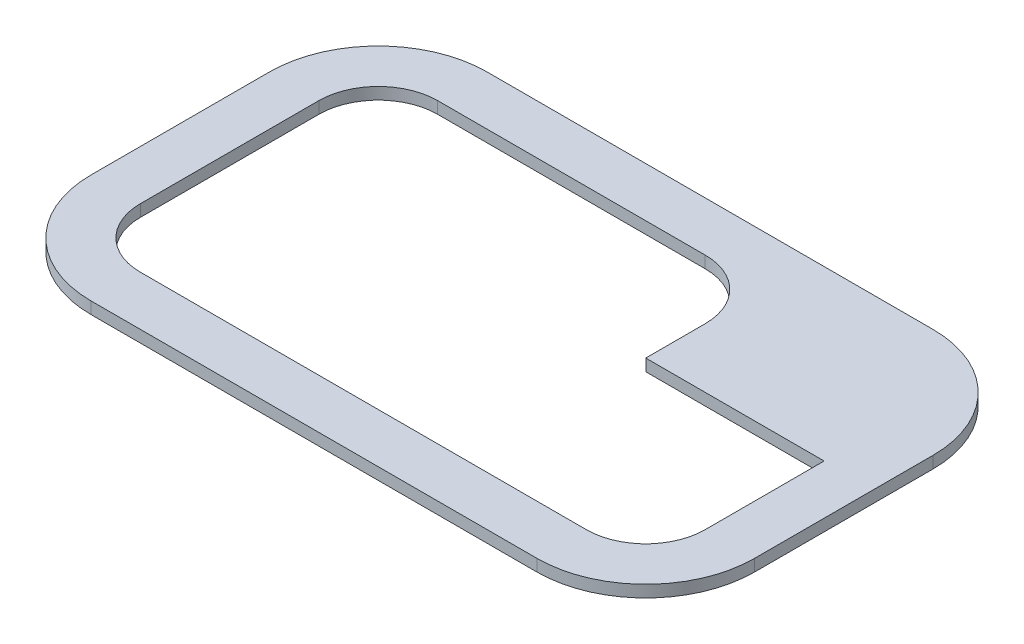
ISO-10303-21;
HEADER;
FILE_DESCRIPTION(('STEP AP214'),'2;1');
FILE_NAME('part.step','',(''),(''),'','','');
FILE_SCHEMA(('AUTOMOTIVE_DESIGN { 1 0 10303 214 1 1 1 1 }'));
ENDSEC;
DATA;
#1=APPLICATION_CONTEXT('core data for automotive mechanical design processes');
#2=APPLICATION_PROTOCOL_DEFINITION('international standard','automotive_design',2000,#1);
#3=PRODUCT_CONTEXT('',#1,'mechanical');
#4=PRODUCT('Part','Part','',(#3));
#5=PRODUCT_RELATED_PRODUCT_CATEGORY('part','',(#4));
#6=PRODUCT_DEFINITION_FORMATION('','',#4);
#7=PRODUCT_DEFINITION_CONTEXT('part definition',#1,'design');
#8=PRODUCT_DEFINITION('design','',#6,#7);
#9=PRODUCT_DEFINITION_SHAPE('','',#8);
#10=(LENGTH_UNIT() NAMED_UNIT(*) SI_UNIT(.MILLI.,.METRE.));
#11=(NAMED_UNIT(*) PLANE_ANGLE_UNIT() SI_UNIT($,.RADIAN.));
#12=(NAMED_UNIT(*) SI_UNIT($,.STERADIAN.) SOLID_ANGLE_UNIT());
#13=UNCERTAINTY_MEASURE_WITH_UNIT(LENGTH_MEASURE(1.E-05),#10,'distance_accuracy_value','');
#14=(GEOMETRIC_REPRESENTATION_CONTEXT(3) GLOBAL_UNCERTAINTY_ASSIGNED_CONTEXT((#13)) GLOBAL_UNIT_ASSIGNED_CONTEXT((#10,
#11,#12)) REPRESENTATION_CONTEXT('',''));
#15=CARTESIAN_POINT('',(0.,0.,0.));
#16=DIRECTION('',(0.,0.,1.));
#17=DIRECTION('',(1.,0.,0.));
#18=AXIS2_PLACEMENT_3D('',#15,#16,#17);
#19=CARTESIAN_POINT('',(225.,6.,-90.));
#20=DIRECTION('',(0.,-1.,0.));
#21=DIRECTION('',(0.,0.,-1.));
#22=AXIS2_PLACEMENT_3D('',#19,#20,#21);
#23=PLANE('',#22);
#24=CARTESIAN_POINT('',(225.,6.,-90.));
#25=DIRECTION('',(0.,1.,0.));
#26=DIRECTION('',(0.,0.,-1.));
#27=AXIS2_PLACEMENT_3D('',#24,#25,#26);
#28=CIRCLE('',#27,55.);
#29=CARTESIAN_POINT('',(280.,6.,-90.));
#30=VERTEX_POINT('',#29);
#31=CARTESIAN_POINT('',(225.,6.,-145.));
#32=VERTEX_POINT('',#31);
#33=EDGE_CURVE('E239',#30,#32,#28,.T.);
#34=ORIENTED_EDGE('',*,*,#33,.T.);
#35=DIRECTION('',(-1.,0.,0.));
#36=VECTOR('',#35,1.);
#37=CARTESIAN_POINT('',(0.,6.,-145.));
#38=LINE('',#37,#36);
#39=CARTESIAN_POINT('',(0.,6.,-145.));
#40=VERTEX_POINT('',#39);
#41=EDGE_CURVE('E242',#32,#40,#38,.T.);
#42=ORIENTED_EDGE('',*,*,#41,.T.);
#43=CARTESIAN_POINT('',(0.,6.,-90.));
#44=DIRECTION('',(0.,1.,0.));
#45=DIRECTION('',(0.,0.,-1.));
#46=AXIS2_PLACEMENT_3D('',#43,#44,#45);
#47=CIRCLE('',#46,55.);
#48=CARTESIAN_POINT('',(-55.,6.,-90.));
#49=VERTEX_POINT('',#48);
#50=EDGE_CURVE('E245',#40,#49,#47,.T.);
#51=ORIENTED_EDGE('',*,*,#50,.T.);
#52=DIRECTION('',(0.,0.,1.));
#53=VECTOR('',#52,1.);
#54=CARTESIAN_POINT('',(-55.,6.,0.));
#55=LINE('',#54,#53);
#56=CARTESIAN_POINT('',(-55.,6.,0.));
#57=VERTEX_POINT('',#56);
#58=EDGE_CURVE('E247',#49,#57,#55,.T.);
#59=ORIENTED_EDGE('',*,*,#58,.T.);
#60=CARTESIAN_POINT('',(0.,6.,0.));
#61=DIRECTION('',(0.,1.,0.));
#62=DIRECTION('',(0.,0.,-1.));
#63=AXIS2_PLACEMENT_3D('',#60,#61,#62);
#64=CIRCLE('',#63,55.);
#65=CARTESIAN_POINT('',(0.,6.,55.));
#66=VERTEX_POINT('',#65);
#67=EDGE_CURVE('E249',#57,#66,#64,.T.);
#68=ORIENTED_EDGE('',*,*,#67,.T.);
#69=DIRECTION('',(1.,0.,0.));
#70=VECTOR('',#69,1.);
#71=CARTESIAN_POINT('',(0.,6.,55.));
#72=LINE('',#71,#70);
#73=CARTESIAN_POINT('',(225.,6.,55.));
#74=VERTEX_POINT('',#73);
#75=EDGE_CURVE('E251',#66,#74,#72,.T.);
#76=ORIENTED_EDGE('',*,*,#75,.T.);
#77=CARTESIAN_POINT('',(225.,6.,0.));
#78=DIRECTION('',(0.,1.,0.));
#79=DIRECTION('',(0.,0.,1.));
#80=AXIS2_PLACEMENT_3D('',#77,#78,#79);
#81=CIRCLE('',#80,55.);
#82=CARTESIAN_POINT('',(280.,6.,0.));
#83=VERTEX_POINT('',#82);
#84=EDGE_CURVE('E253',#74,#83,#81,.T.);
#85=ORIENTED_EDGE('',*,*,#84,.T.);
#86=DIRECTION('',(0.,0.,-1.));
#87=VECTOR('',#86,1.);
#88=CARTESIAN_POINT('',(280.,6.,0.));
#89=LINE('',#88,#87);
#90=EDGE_CURVE('E255',#83,#30,#89,.T.);
#91=ORIENTED_EDGE('',*,*,#90,.T.);
#92=EDGE_LOOP('',(#34,#42,#51,#59,#68,#76,#85,#91));
#93=FACE_BOUND('',#92,.T.);
#94=CARTESIAN_POINT('',(0.,6.,0.));
#95=DIRECTION('',(0.,1.,0.));
#96=DIRECTION('',(0.,0.,-1.));
#97=AXIS2_PLACEMENT_3D('',#94,#95,#96);
#98=CIRCLE('',#97,30.);
#99=CARTESIAN_POINT('',(-30.,6.,0.));
#100=VERTEX_POINT('',#99);
#101=CARTESIAN_POINT('',(0.,6.,30.));
#102=VERTEX_POINT('',#101);
#103=EDGE_CURVE('E160',#100,#102,#98,.T.);
#104=ORIENTED_EDGE('',*,*,#103,.F.);
#105=DIRECTION('',(0.,0.,1.));
#106=VECTOR('',#105,1.);
#107=CARTESIAN_POINT('',(-30.,6.,0.));
#108=LINE('',#107,#106);
#109=CARTESIAN_POINT('',(-30.,6.,-90.));
#110=VERTEX_POINT('',#109);
#111=EDGE_CURVE('E197',#110,#100,#108,.T.);
#112=ORIENTED_EDGE('',*,*,#111,.F.);
#113=CARTESIAN_POINT('',(0.,6.,-90.));
#114=DIRECTION('',(0.,1.,0.));
#115=DIRECTION('',(0.,0.,-1.));
#116=AXIS2_PLACEMENT_3D('',#113,#114,#115);
#117=CIRCLE('',#116,30.);
#118=CARTESIAN_POINT('',(0.,6.,-120.));
#119=VERTEX_POINT('',#118);
#120=EDGE_CURVE('E195',#119,#110,#117,.T.);
#121=ORIENTED_EDGE('',*,*,#120,.F.);
#122=DIRECTION('',(-1.,0.,0.));
#123=VECTOR('',#122,1.);
#124=CARTESIAN_POINT('',(0.,6.,-120.));
#125=LINE('',#124,#123);
#126=CARTESIAN_POINT('',(135.,6.,-120.));
#127=VERTEX_POINT('',#126);
#128=EDGE_CURVE('E193',#127,#119,#125,.T.);
#129=ORIENTED_EDGE('',*,*,#128,.F.);
#130=CARTESIAN_POINT('',(135.,6.,-90.));
#131=DIRECTION('',(0.,1.,0.));
#132=DIRECTION('',(0.,0.,-1.));
#133=AXIS2_PLACEMENT_3D('',#130,#131,#132);
#134=CIRCLE('',#133,30.);
#135=CARTESIAN_POINT('',(165.,6.,-90.));
#136=VERTEX_POINT('',#135);
#137=EDGE_CURVE('E191',#136,#127,#134,.T.);
#138=ORIENTED_EDGE('',*,*,#137,.F.);
#139=DIRECTION('',(0.,0.,-1.));
#140=VECTOR('',#139,1.);
#141=CARTESIAN_POINT('',(165.,6.,-90.));
#142=LINE('',#141,#140);
#143=CARTESIAN_POINT('',(165.,6.,-60.));
#144=VERTEX_POINT('',#143);
#145=EDGE_CURVE('E189',#144,#136,#142,.T.);
#146=ORIENTED_EDGE('',*,*,#145,.F.);
#147=DIRECTION('',(-1.,0.,0.));
#148=VECTOR('',#147,1.);
#149=CARTESIAN_POINT('',(165.,6.,-60.));
#150=LINE('',#149,#148);
#151=CARTESIAN_POINT('',(255.,6.,-60.));
#152=VERTEX_POINT('',#151);
#153=EDGE_CURVE('E187',#152,#144,#150,.T.);
#154=ORIENTED_EDGE('',*,*,#153,.F.);
#155=DIRECTION('',(0.,0.,-1.));
#156=VECTOR('',#155,1.);
#157=CARTESIAN_POINT('',(255.,6.,-60.));
#158=LINE('',#157,#156);
#159=CARTESIAN_POINT('',(255.,6.,0.));
#160=VERTEX_POINT('',#159);
#161=EDGE_CURVE('E183',#160,#152,#158,.T.);
#162=ORIENTED_EDGE('',*,*,#161,.F.);
#163=CARTESIAN_POINT('',(225.,6.,0.));
#164=DIRECTION('',(0.,1.,0.));
#165=DIRECTION('',(0.,0.,1.));
#166=AXIS2_PLACEMENT_3D('',#163,#164,#165);
#167=CIRCLE('',#166,30.);
#168=CARTESIAN_POINT('',(225.,6.,30.));
#169=VERTEX_POINT('',#168);
#170=EDGE_CURVE('E181',#169,#160,#167,.T.);
#171=ORIENTED_EDGE('',*,*,#170,.F.);
#172=DIRECTION('',(1.,0.,0.));
#173=VECTOR('',#172,1.);
#174=CARTESIAN_POINT('',(0.,6.,30.));
#175=LINE('',#174,#173);
#176=EDGE_CURVE('E168',#102,#169,#175,.T.);
#177=ORIENTED_EDGE('',*,*,#176,.F.);
#178=EDGE_LOOP('',(#104,#112,#121,#129,#138,#146,#154,#162,#171,#177));
#179=FACE_BOUND('',#178,.T.);
#180=ADVANCED_FACE('F35',(#93,#179),#23,.F.);
#181=CARTESIAN_POINT('',(225.,0.,-90.));
#182=DIRECTION('',(0.,-1.,0.));
#183=DIRECTION('',(0.,0.,-1.));
#184=AXIS2_PLACEMENT_3D('',#181,#182,#183);
#185=PLANE('',#184);
#186=CARTESIAN_POINT('',(225.,0.,-90.));
#187=DIRECTION('',(0.,1.,0.));
#188=DIRECTION('',(0.,0.,-1.));
#189=AXIS2_PLACEMENT_3D('',#186,#187,#188);
#190=CIRCLE('',#189,55.);
#191=CARTESIAN_POINT('',(280.,0.,-90.));
#192=VERTEX_POINT('',#191);
#193=CARTESIAN_POINT('',(225.,0.,-145.));
#194=VERTEX_POINT('',#193);
#195=EDGE_CURVE('E176',#192,#194,#190,.T.);
#196=ORIENTED_EDGE('',*,*,#195,.F.);
#197=DIRECTION('',(0.,0.,-1.));
#198=VECTOR('',#197,1.);
#199=CARTESIAN_POINT('',(280.,0.,0.));
#200=LINE('',#199,#198);
#201=CARTESIAN_POINT('',(280.,0.,0.));
#202=VERTEX_POINT('',#201);
#203=EDGE_CURVE('E243',#202,#192,#200,.T.);
#204=ORIENTED_EDGE('',*,*,#203,.F.);
#205=CARTESIAN_POINT('',(225.,0.,0.));
#206=DIRECTION('',(0.,1.,0.));
#207=DIRECTION('',(0.,0.,1.));
#208=AXIS2_PLACEMENT_3D('',#205,#206,#207);
#209=CIRCLE('',#208,55.);
#210=CARTESIAN_POINT('',(225.,0.,55.));
#211=VERTEX_POINT('',#210);
#212=EDGE_CURVE('E270',#211,#202,#209,.T.);
#213=ORIENTED_EDGE('',*,*,#212,.F.);
#214=DIRECTION('',(1.,0.,0.));
#215=VECTOR('',#214,1.);
#216=CARTESIAN_POINT('',(0.,0.,55.));
#217=LINE('',#216,#215);
#218=CARTESIAN_POINT('',(0.,0.,55.));
#219=VERTEX_POINT('',#218);
#220=EDGE_CURVE('E268',#219,#211,#217,.T.);
#221=ORIENTED_EDGE('',*,*,#220,.F.);
#222=CARTESIAN_POINT('',(0.,0.,0.));
#223=DIRECTION('',(0.,1.,0.));
#224=DIRECTION('',(0.,0.,-1.));
#225=AXIS2_PLACEMENT_3D('',#222,#223,#224);
#226=CIRCLE('',#225,55.);
#227=CARTESIAN_POINT('',(-55.,0.,0.));
#228=VERTEX_POINT('',#227);
#229=EDGE_CURVE('E266',#228,#219,#226,.T.);
#230=ORIENTED_EDGE('',*,*,#229,.F.);
#231=DIRECTION('',(0.,0.,1.));
#232=VECTOR('',#231,1.);
#233=CARTESIAN_POINT('',(-55.,0.,0.));
#234=LINE('',#233,#232);
#235=CARTESIAN_POINT('',(-55.,0.,-90.));
#236=VERTEX_POINT('',#235);
#237=EDGE_CURVE('E264',#236,#228,#234,.T.);
#238=ORIENTED_EDGE('',*,*,#237,.F.);
#239=CARTESIAN_POINT('',(0.,0.,-90.));
#240=DIRECTION('',(0.,1.,0.));
#241=DIRECTION('',(0.,0.,-1.));
#242=AXIS2_PLACEMENT_3D('',#239,#240,#241);
#243=CIRCLE('',#242,55.);
#244=CARTESIAN_POINT('',(0.,0.,-145.));
#245=VERTEX_POINT('',#244);
#246=EDGE_CURVE('E262',#245,#236,#243,.T.);
#247=ORIENTED_EDGE('',*,*,#246,.F.);
#248=DIRECTION('',(-1.,0.,0.));
#249=VECTOR('',#248,1.);
#250=CARTESIAN_POINT('',(0.,0.,-145.));
#251=LINE('',#250,#249);
#252=EDGE_CURVE('E260',#194,#245,#251,.T.);
#253=ORIENTED_EDGE('',*,*,#252,.F.);
#254=EDGE_LOOP('',(#196,#204,#213,#221,#230,#238,#247,#253));
#255=FACE_BOUND('',#254,.T.);
#256=DIRECTION('',(0.,0.,1.));
#257=VECTOR('',#256,1.);
#258=CARTESIAN_POINT('',(-30.,0.,0.));
#259=LINE('',#258,#257);
#260=CARTESIAN_POINT('',(-30.,0.,-90.));
#261=VERTEX_POINT('',#260);
#262=CARTESIAN_POINT('',(-30.,0.,0.));
#263=VERTEX_POINT('',#262);
#264=EDGE_CURVE('E169',#261,#263,#259,.T.);
#265=ORIENTED_EDGE('',*,*,#264,.T.);
#266=CARTESIAN_POINT('',(0.,0.,0.));
#267=DIRECTION('',(0.,1.,0.));
#268=DIRECTION('',(0.,0.,-1.));
#269=AXIS2_PLACEMENT_3D('',#266,#267,#268);
#270=CIRCLE('',#269,30.);
#271=CARTESIAN_POINT('',(0.,0.,30.));
#272=VERTEX_POINT('',#271);
#273=EDGE_CURVE('E58',#263,#272,#270,.T.);
#274=ORIENTED_EDGE('',*,*,#273,.T.);
#275=DIRECTION('',(1.,0.,0.));
#276=VECTOR('',#275,1.);
#277=CARTESIAN_POINT('',(0.,0.,30.));
#278=LINE('',#277,#276);
#279=CARTESIAN_POINT('',(225.,0.,30.));
#280=VERTEX_POINT('',#279);
#281=EDGE_CURVE('E175',#272,#280,#278,.T.);
#282=ORIENTED_EDGE('',*,*,#281,.T.);
#283=CARTESIAN_POINT('',(225.,0.,0.));
#284=DIRECTION('',(0.,1.,0.));
#285=DIRECTION('',(0.,0.,1.));
#286=AXIS2_PLACEMENT_3D('',#283,#284,#285);
#287=CIRCLE('',#286,30.);
#288=CARTESIAN_POINT('',(255.,0.,0.));
#289=VERTEX_POINT('',#288);
#290=EDGE_CURVE('E201',#280,#289,#287,.T.);
#291=ORIENTED_EDGE('',*,*,#290,.T.);
#292=DIRECTION('',(0.,0.,-1.));
#293=VECTOR('',#292,1.);
#294=CARTESIAN_POINT('',(255.,0.,-60.));
#295=LINE('',#294,#293);
#296=CARTESIAN_POINT('',(255.,0.,-60.));
#297=VERTEX_POINT('',#296);
#298=EDGE_CURVE('E204',#289,#297,#295,.T.);
#299=ORIENTED_EDGE('',*,*,#298,.T.);
#300=DIRECTION('',(-1.,0.,0.));
#301=VECTOR('',#300,1.);
#302=CARTESIAN_POINT('',(165.,0.,-60.));
#303=LINE('',#302,#301);
#304=CARTESIAN_POINT('',(165.,0.,-60.));
#305=VERTEX_POINT('',#304);
#306=EDGE_CURVE('E207',#297,#305,#303,.T.);
#307=ORIENTED_EDGE('',*,*,#306,.T.);
#308=DIRECTION('',(0.,0.,-1.));
#309=VECTOR('',#308,1.);
#310=CARTESIAN_POINT('',(165.,0.,-90.));
#311=LINE('',#310,#309);
#312=CARTESIAN_POINT('',(165.,0.,-90.));
#313=VERTEX_POINT('',#312);
#314=EDGE_CURVE('E210',#305,#313,#311,.T.);
#315=ORIENTED_EDGE('',*,*,#314,.T.);
#316=CARTESIAN_POINT('',(135.,0.,-90.));
#317=DIRECTION('',(0.,1.,0.));
#318=DIRECTION('',(0.,0.,-1.));
#319=AXIS2_PLACEMENT_3D('',#316,#317,#318);
#320=CIRCLE('',#319,30.);
#321=CARTESIAN_POINT('',(135.,0.,-120.));
#322=VERTEX_POINT('',#321);
#323=EDGE_CURVE('E213',#313,#322,#320,.T.);
#324=ORIENTED_EDGE('',*,*,#323,.T.);
#325=DIRECTION('',(-1.,0.,0.));
#326=VECTOR('',#325,1.);
#327=CARTESIAN_POINT('',(0.,0.,-120.));
#328=LINE('',#327,#326);
#329=CARTESIAN_POINT('',(0.,0.,-120.));
#330=VERTEX_POINT('',#329);
#331=EDGE_CURVE('E216',#322,#330,#328,.T.);
#332=ORIENTED_EDGE('',*,*,#331,.T.);
#333=CARTESIAN_POINT('',(0.,0.,-90.));
#334=DIRECTION('',(0.,1.,0.));
#335=DIRECTION('',(0.,0.,-1.));
#336=AXIS2_PLACEMENT_3D('',#333,#334,#335);
#337=CIRCLE('',#336,30.);
#338=EDGE_CURVE('E219',#330,#261,#337,.T.);
#339=ORIENTED_EDGE('',*,*,#338,.T.);
#340=EDGE_LOOP('',(#265,#274,#282,#291,#299,#307,#315,#324,#332,#339));
#341=FACE_BOUND('',#340,.T.);
#342=ADVANCED_FACE('F300',(#255,#341),#185,.T.);
#343=CARTESIAN_POINT('',(225.,6.,-90.));
#344=DIRECTION('',(0.,-1.,0.));
#345=DIRECTION('',(0.,0.,-1.));
#346=AXIS2_PLACEMENT_3D('',#343,#344,#345);
#347=CYLINDRICAL_SURFACE('',#346,55.);
#348=ORIENTED_EDGE('',*,*,#195,.T.);
#349=DIRECTION('',(0.,-1.,0.));
#350=VECTOR('',#349,1.);
#351=CARTESIAN_POINT('',(225.,6.,-145.));
#352=LINE('',#351,#350);
#353=EDGE_CURVE('E11',#32,#194,#352,.T.);
#354=ORIENTED_EDGE('',*,*,#353,.F.);
#355=ORIENTED_EDGE('',*,*,#33,.F.);
#356=DIRECTION('',(0.,-1.,0.));
#357=VECTOR('',#356,1.);
#358=CARTESIAN_POINT('',(280.,6.,-90.));
#359=LINE('',#358,#357);
#360=EDGE_CURVE('E257',#30,#192,#359,.T.);
#361=ORIENTED_EDGE('',*,*,#360,.T.);
#362=EDGE_LOOP('',(#348,#354,#355,#361));
#363=FACE_BOUND('',#362,.T.);
#364=ADVANCED_FACE('F37',(#363),#347,.T.);
#365=CARTESIAN_POINT('',(0.,6.,-145.));
#366=DIRECTION('',(0.,0.,1.));
#367=DIRECTION('',(1.,0.,0.));
#368=AXIS2_PLACEMENT_3D('',#365,#366,#367);
#369=PLANE('',#368);
#370=ORIENTED_EDGE('',*,*,#252,.T.);
#371=DIRECTION('',(0.,-1.,0.));
#372=VECTOR('',#371,1.);
#373=CARTESIAN_POINT('',(0.,6.,-145.));
#374=LINE('',#373,#372);
#375=EDGE_CURVE('E43',#40,#245,#374,.T.);
#376=ORIENTED_EDGE('',*,*,#375,.F.);
#377=ORIENTED_EDGE('',*,*,#41,.F.);
#378=ORIENTED_EDGE('',*,*,#353,.T.);
#379=EDGE_LOOP('',(#370,#376,#377,#378));
#380=FACE_BOUND('',#379,.T.);
#381=ADVANCED_FACE('F317',(#380),#369,.F.);
#382=CARTESIAN_POINT('',(0.,6.,-90.));
#383=DIRECTION('',(0.,-1.,0.));
#384=DIRECTION('',(0.,0.,-1.));
#385=AXIS2_PLACEMENT_3D('',#382,#383,#384);
#386=CYLINDRICAL_SURFACE('',#385,55.);
#387=ORIENTED_EDGE('',*,*,#246,.T.);
#388=DIRECTION('',(0.,-1.,0.));
#389=VECTOR('',#388,1.);
#390=CARTESIAN_POINT('',(-55.,6.,-90.));
#391=LINE('',#390,#389);
#392=EDGE_CURVE('E287',#49,#236,#391,.T.);
#393=ORIENTED_EDGE('',*,*,#392,.F.);
#394=ORIENTED_EDGE('',*,*,#50,.F.);
#395=ORIENTED_EDGE('',*,*,#375,.T.);
#396=EDGE_LOOP('',(#387,#393,#394,#395));
#397=FACE_BOUND('',#396,.T.);
#398=ADVANCED_FACE('F294',(#397),#386,.T.);
#399=CARTESIAN_POINT('',(-55.,6.,0.));
#400=DIRECTION('',(1.,0.,0.));
#401=DIRECTION('',(0.,0.,-1.));
#402=AXIS2_PLACEMENT_3D('',#399,#400,#401);
#403=PLANE('',#402);
#404=ORIENTED_EDGE('',*,*,#237,.T.);
#405=DIRECTION('',(0.,-1.,0.));
#406=VECTOR('',#405,1.);
#407=CARTESIAN_POINT('',(-55.,6.,0.));
#408=LINE('',#407,#406);
#409=EDGE_CURVE('E284',#57,#228,#408,.T.);
#410=ORIENTED_EDGE('',*,*,#409,.F.);
#411=ORIENTED_EDGE('',*,*,#58,.F.);
#412=ORIENTED_EDGE('',*,*,#392,.T.);
#413=EDGE_LOOP('',(#404,#410,#411,#412));
#414=FACE_BOUND('',#413,.T.);
#415=ADVANCED_FACE('F306',(#414),#403,.F.);
#416=CARTESIAN_POINT('',(0.,6.,0.));
#417=DIRECTION('',(0.,-1.,0.));
#418=DIRECTION('',(0.,0.,-1.));
#419=AXIS2_PLACEMENT_3D('',#416,#417,#418);
#420=CYLINDRICAL_SURFACE('',#419,55.);
#421=ORIENTED_EDGE('',*,*,#229,.T.);
#422=DIRECTION('',(0.,-1.,0.));
#423=VECTOR('',#422,1.);
#424=CARTESIAN_POINT('',(0.,6.,55.));
#425=LINE('',#424,#423);
#426=EDGE_CURVE('E281',#66,#219,#425,.T.);
#427=ORIENTED_EDGE('',*,*,#426,.F.);
#428=ORIENTED_EDGE('',*,*,#67,.F.);
#429=ORIENTED_EDGE('',*,*,#409,.T.);
#430=EDGE_LOOP('',(#421,#427,#428,#429));
#431=FACE_BOUND('',#430,.T.);
#432=ADVANCED_FACE('F310',(#431),#420,.T.);
#433=CARTESIAN_POINT('',(0.,6.,55.));
#434=DIRECTION('',(0.,0.,-1.));
#435=DIRECTION('',(-1.,0.,0.));
#436=AXIS2_PLACEMENT_3D('',#433,#434,#435);
#437=PLANE('',#436);
#438=ORIENTED_EDGE('',*,*,#220,.T.);
#439=DIRECTION('',(0.,-1.,0.));
#440=VECTOR('',#439,1.);
#441=CARTESIAN_POINT('',(225.,6.,55.));
#442=LINE('',#441,#440);
#443=EDGE_CURVE('E278',#74,#211,#442,.T.);
#444=ORIENTED_EDGE('',*,*,#443,.F.);
#445=ORIENTED_EDGE('',*,*,#75,.F.);
#446=ORIENTED_EDGE('',*,*,#426,.T.);
#447=EDGE_LOOP('',(#438,#444,#445,#446));
#448=FACE_BOUND('',#447,.T.);
#449=ADVANCED_FACE('F330',(#448),#437,.F.);
#450=CARTESIAN_POINT('',(225.,6.,0.));
#451=DIRECTION('',(0.,-1.,0.));
#452=DIRECTION('',(0.,0.,-1.));
#453=AXIS2_PLACEMENT_3D('',#450,#451,#452);
#454=CYLINDRICAL_SURFACE('',#453,55.);
#455=ORIENTED_EDGE('',*,*,#212,.T.);
#456=DIRECTION('',(0.,-1.,0.));
#457=VECTOR('',#456,1.);
#458=CARTESIAN_POINT('',(280.,6.,0.));
#459=LINE('',#458,#457);
#460=EDGE_CURVE('E275',#83,#202,#459,.T.);
#461=ORIENTED_EDGE('',*,*,#460,.F.);
#462=ORIENTED_EDGE('',*,*,#84,.F.);
#463=ORIENTED_EDGE('',*,*,#443,.T.);
#464=EDGE_LOOP('',(#455,#461,#462,#463));
#465=FACE_BOUND('',#464,.T.);
#466=ADVANCED_FACE('F328',(#465),#454,.T.);
#467=CARTESIAN_POINT('',(280.,6.,0.));
#468=DIRECTION('',(-1.,0.,0.));
#469=DIRECTION('',(0.,0.,1.));
#470=AXIS2_PLACEMENT_3D('',#467,#468,#469);
#471=PLANE('',#470);
#472=ORIENTED_EDGE('',*,*,#203,.T.);
#473=ORIENTED_EDGE('',*,*,#360,.F.);
#474=ORIENTED_EDGE('',*,*,#90,.F.);
#475=ORIENTED_EDGE('',*,*,#460,.T.);
#476=EDGE_LOOP('',(#472,#473,#474,#475));
#477=FACE_BOUND('',#476,.T.);
#478=ADVANCED_FACE('F323',(#477),#471,.F.);
#479=CARTESIAN_POINT('',(0.,6.,0.));
#480=DIRECTION('',(0.,-1.,0.));
#481=DIRECTION('',(0.,0.,-1.));
#482=AXIS2_PLACEMENT_3D('',#479,#480,#481);
#483=CYLINDRICAL_SURFACE('',#482,30.);
#484=ORIENTED_EDGE('',*,*,#273,.F.);
#485=DIRECTION('',(0.,-1.,0.));
#486=VECTOR('',#485,1.);
#487=CARTESIAN_POINT('',(-30.,6.,0.));
#488=LINE('',#487,#486);
#489=EDGE_CURVE('E164',#100,#263,#488,.T.);
#490=ORIENTED_EDGE('',*,*,#489,.F.);
#491=ORIENTED_EDGE('',*,*,#103,.T.);
#492=DIRECTION('',(0.,-1.,0.));
#493=VECTOR('',#492,1.);
#494=CARTESIAN_POINT('',(0.,6.,30.));
#495=LINE('',#494,#493);
#496=EDGE_CURVE('E163',#102,#272,#495,.T.);
#497=ORIENTED_EDGE('',*,*,#496,.T.);
#498=EDGE_LOOP('',(#484,#490,#491,#497));
#499=FACE_BOUND('',#498,.T.);
#500=ADVANCED_FACE('F162',(#499),#483,.F.);
#501=CARTESIAN_POINT('',(0.,6.,30.));
#502=DIRECTION('',(0.,0.,-1.));
#503=DIRECTION('',(-1.,0.,0.));
#504=AXIS2_PLACEMENT_3D('',#501,#502,#503);
#505=PLANE('',#504);
#506=ORIENTED_EDGE('',*,*,#281,.F.);
#507=ORIENTED_EDGE('',*,*,#496,.F.);
#508=ORIENTED_EDGE('',*,*,#176,.T.);
#509=DIRECTION('',(0.,-1.,0.));
#510=VECTOR('',#509,1.);
#511=CARTESIAN_POINT('',(225.,6.,30.));
#512=LINE('',#511,#510);
#513=EDGE_CURVE('E177',#169,#280,#512,.T.);
#514=ORIENTED_EDGE('',*,*,#513,.T.);
#515=EDGE_LOOP('',(#506,#507,#508,#514));
#516=FACE_BOUND('',#515,.T.);
#517=ADVANCED_FACE('F172',(#516),#505,.T.);
#518=CARTESIAN_POINT('',(225.,6.,0.));
#519=DIRECTION('',(0.,-1.,0.));
#520=DIRECTION('',(0.,0.,-1.));
#521=AXIS2_PLACEMENT_3D('',#518,#519,#520);
#522=CYLINDRICAL_SURFACE('',#521,30.);
#523=ORIENTED_EDGE('',*,*,#290,.F.);
#524=ORIENTED_EDGE('',*,*,#513,.F.);
#525=ORIENTED_EDGE('',*,*,#170,.T.);
#526=DIRECTION('',(0.,-1.,0.));
#527=VECTOR('',#526,1.);
#528=CARTESIAN_POINT('',(255.,6.,0.));
#529=LINE('',#528,#527);
#530=EDGE_CURVE('E236',#160,#289,#529,.T.);
#531=ORIENTED_EDGE('',*,*,#530,.T.);
#532=EDGE_LOOP('',(#523,#524,#525,#531));
#533=FACE_BOUND('',#532,.T.);
#534=ADVANCED_FACE('F355',(#533),#522,.F.);
#535=CARTESIAN_POINT('',(255.,6.,-60.));
#536=DIRECTION('',(-1.,0.,0.));
#537=DIRECTION('',(0.,0.,1.));
#538=AXIS2_PLACEMENT_3D('',#535,#536,#537);
#539=PLANE('',#538);
#540=ORIENTED_EDGE('',*,*,#298,.F.);
#541=ORIENTED_EDGE('',*,*,#530,.F.);
#542=ORIENTED_EDGE('',*,*,#161,.T.);
#543=DIRECTION('',(0.,-1.,0.));
#544=VECTOR('',#543,1.);
#545=CARTESIAN_POINT('',(255.,6.,-60.));
#546=LINE('',#545,#544);
#547=EDGE_CURVE('E234',#152,#297,#546,.T.);
#548=ORIENTED_EDGE('',*,*,#547,.T.);
#549=EDGE_LOOP('',(#540,#541,#542,#548));
#550=FACE_BOUND('',#549,.T.);
#551=ADVANCED_FACE('F359',(#550),#539,.T.);
#552=CARTESIAN_POINT('',(165.,6.,-60.));
#553=DIRECTION('',(0.,0.,1.));
#554=DIRECTION('',(1.,0.,0.));
#555=AXIS2_PLACEMENT_3D('',#552,#553,#554);
#556=PLANE('',#555);
#557=ORIENTED_EDGE('',*,*,#306,.F.);
#558=ORIENTED_EDGE('',*,*,#547,.F.);
#559=ORIENTED_EDGE('',*,*,#153,.T.);
#560=DIRECTION('',(0.,-1.,0.));
#561=VECTOR('',#560,1.);
#562=CARTESIAN_POINT('',(165.,6.,-60.));
#563=LINE('',#562,#561);
#564=EDGE_CURVE('E232',#144,#305,#563,.T.);
#565=ORIENTED_EDGE('',*,*,#564,.T.);
#566=EDGE_LOOP('',(#557,#558,#559,#565));
#567=FACE_BOUND('',#566,.T.);
#568=ADVANCED_FACE('F365',(#567),#556,.T.);
#569=CARTESIAN_POINT('',(165.,6.,-90.));
#570=DIRECTION('',(-1.,0.,0.));
#571=DIRECTION('',(0.,0.,1.));
#572=AXIS2_PLACEMENT_3D('',#569,#570,#571);
#573=PLANE('',#572);
#574=ORIENTED_EDGE('',*,*,#314,.F.);
#575=ORIENTED_EDGE('',*,*,#564,.F.);
#576=ORIENTED_EDGE('',*,*,#145,.T.);
#577=DIRECTION('',(0.,-1.,0.));
#578=VECTOR('',#577,1.);
#579=CARTESIAN_POINT('',(165.,6.,-90.));
#580=LINE('',#579,#578);
#581=EDGE_CURVE('E230',#136,#313,#580,.T.);
#582=ORIENTED_EDGE('',*,*,#581,.T.);
#583=EDGE_LOOP('',(#574,#575,#576,#582));
#584=FACE_BOUND('',#583,.T.);
#585=ADVANCED_FACE('F369',(#584),#573,.T.);
#586=CARTESIAN_POINT('',(135.,6.,-90.));
#587=DIRECTION('',(0.,-1.,0.));
#588=DIRECTION('',(0.,0.,-1.));
#589=AXIS2_PLACEMENT_3D('',#586,#587,#588);
#590=CYLINDRICAL_SURFACE('',#589,30.);
#591=ORIENTED_EDGE('',*,*,#323,.F.);
#592=ORIENTED_EDGE('',*,*,#581,.F.);
#593=ORIENTED_EDGE('',*,*,#137,.T.);
#594=DIRECTION('',(0.,-1.,0.));
#595=VECTOR('',#594,1.);
#596=CARTESIAN_POINT('',(135.,6.,-120.));
#597=LINE('',#596,#595);
#598=EDGE_CURVE('E228',#127,#322,#597,.T.);
#599=ORIENTED_EDGE('',*,*,#598,.T.);
#600=EDGE_LOOP('',(#591,#592,#593,#599));
#601=FACE_BOUND('',#600,.T.);
#602=ADVANCED_FACE('F373',(#601),#590,.F.);
#603=CARTESIAN_POINT('',(0.,6.,-120.));
#604=DIRECTION('',(0.,0.,1.));
#605=DIRECTION('',(1.,0.,0.));
#606=AXIS2_PLACEMENT_3D('',#603,#604,#605);
#607=PLANE('',#606);
#608=ORIENTED_EDGE('',*,*,#331,.F.);
#609=ORIENTED_EDGE('',*,*,#598,.F.);
#610=ORIENTED_EDGE('',*,*,#128,.T.);
#611=DIRECTION('',(0.,-1.,0.));
#612=VECTOR('',#611,1.);
#613=CARTESIAN_POINT('',(0.,6.,-120.));
#614=LINE('',#613,#612);
#615=EDGE_CURVE('E226',#119,#330,#614,.T.);
#616=ORIENTED_EDGE('',*,*,#615,.T.);
#617=EDGE_LOOP('',(#608,#609,#610,#616));
#618=FACE_BOUND('',#617,.T.);
#619=ADVANCED_FACE('F377',(#618),#607,.T.);
#620=CARTESIAN_POINT('',(0.,6.,-90.));
#621=DIRECTION('',(0.,-1.,0.));
#622=DIRECTION('',(0.,0.,-1.));
#623=AXIS2_PLACEMENT_3D('',#620,#621,#622);
#624=CYLINDRICAL_SURFACE('',#623,30.);
#625=ORIENTED_EDGE('',*,*,#338,.F.);
#626=ORIENTED_EDGE('',*,*,#615,.F.);
#627=ORIENTED_EDGE('',*,*,#120,.T.);
#628=DIRECTION('',(0.,-1.,0.));
#629=VECTOR('',#628,1.);
#630=CARTESIAN_POINT('',(-30.,6.,-90.));
#631=LINE('',#630,#629);
#632=EDGE_CURVE('E50',#110,#261,#631,.T.);
#633=ORIENTED_EDGE('',*,*,#632,.T.);
#634=EDGE_LOOP('',(#625,#626,#627,#633));
#635=FACE_BOUND('',#634,.T.);
#636=ADVANCED_FACE('F381',(#635),#624,.F.);
#637=CARTESIAN_POINT('',(-30.,6.,0.));
#638=DIRECTION('',(1.,0.,0.));
#639=DIRECTION('',(0.,0.,-1.));
#640=AXIS2_PLACEMENT_3D('',#637,#638,#639);
#641=PLANE('',#640);
#642=ORIENTED_EDGE('',*,*,#264,.F.);
#643=ORIENTED_EDGE('',*,*,#632,.F.);
#644=ORIENTED_EDGE('',*,*,#111,.T.);
#645=ORIENTED_EDGE('',*,*,#489,.T.);
#646=EDGE_LOOP('',(#642,#643,#644,#645));
#647=FACE_BOUND('',#646,.T.);
#648=ADVANCED_FACE('F385',(#647),#641,.T.);
#649=CLOSED_SHELL('',(#180,#342,#364,#381,#398,#415,#432,#449,#466,#478,#500,#517,#534,#551,
#568,#585,#602,#619,#636,#648));
#650=MANIFOLD_SOLID_BREP('B2',#649);
#651=ADVANCED_BREP_SHAPE_REPRESENTATION('',(#18,#650),#14);
#652=SHAPE_DEFINITION_REPRESENTATION(#9,#651);
ENDSEC;
END-ISO-10303-21;
